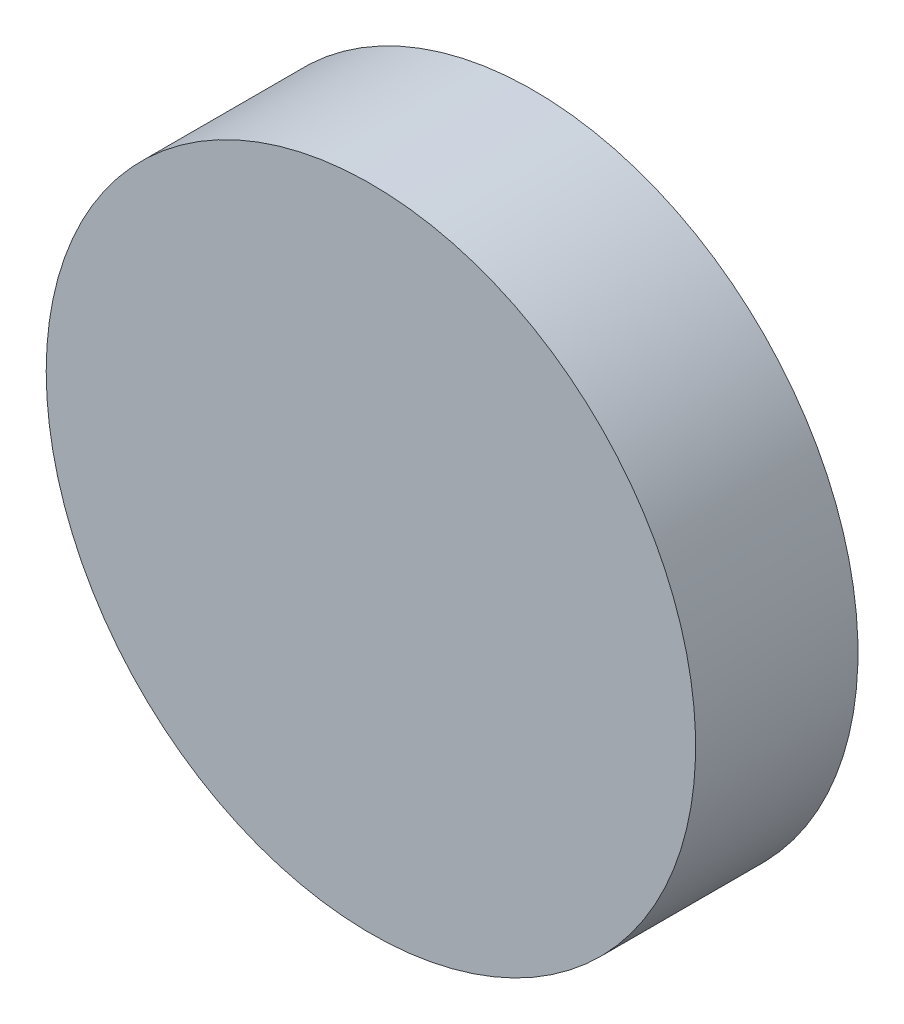
ISO-10303-21;
HEADER;
FILE_DESCRIPTION(('STEP AP214'),'2;1');
FILE_NAME('part.step','',(''),(''),'','','');
FILE_SCHEMA(('AUTOMOTIVE_DESIGN { 1 0 10303 214 1 1 1 1 }'));
ENDSEC;
DATA;
#1=APPLICATION_CONTEXT('core data for automotive mechanical design processes');
#2=APPLICATION_PROTOCOL_DEFINITION('international standard','automotive_design',2000,#1);
#3=PRODUCT_CONTEXT('',#1,'mechanical');
#4=PRODUCT('Part','Part','',(#3));
#5=PRODUCT_RELATED_PRODUCT_CATEGORY('part','',(#4));
#6=PRODUCT_DEFINITION_FORMATION('','',#4);
#7=PRODUCT_DEFINITION_CONTEXT('part definition',#1,'design');
#8=PRODUCT_DEFINITION('design','',#6,#7);
#9=PRODUCT_DEFINITION_SHAPE('','',#8);
#10=(LENGTH_UNIT() NAMED_UNIT(*) SI_UNIT(.MILLI.,.METRE.));
#11=(NAMED_UNIT(*) PLANE_ANGLE_UNIT() SI_UNIT($,.RADIAN.));
#12=(NAMED_UNIT(*) SI_UNIT($,.STERADIAN.) SOLID_ANGLE_UNIT());
#13=UNCERTAINTY_MEASURE_WITH_UNIT(LENGTH_MEASURE(1.E-05),#10,'distance_accuracy_value','');
#14=(GEOMETRIC_REPRESENTATION_CONTEXT(3) GLOBAL_UNCERTAINTY_ASSIGNED_CONTEXT((#13)) GLOBAL_UNIT_ASSIGNED_CONTEXT((#10,
#11,#12)) REPRESENTATION_CONTEXT('',''));
#15=CARTESIAN_POINT('',(0.,0.,0.));
#16=DIRECTION('',(0.,0.,1.));
#17=DIRECTION('',(1.,0.,0.));
#18=AXIS2_PLACEMENT_3D('',#15,#16,#17);
#19=CARTESIAN_POINT('',(0.,2.,0.));
#20=DIRECTION('',(0.,0.,1.));
#21=DIRECTION('',(1.,0.,0.));
#22=AXIS2_PLACEMENT_3D('',#19,#20,#21);
#23=PLANE('',#22);
#24=CARTESIAN_POINT('',(0.,0.,0.));
#25=DIRECTION('',(0.,0.,-1.));
#26=DIRECTION('',(-1.,0.,0.));
#27=AXIS2_PLACEMENT_3D('',#24,#25,#26);
#28=CIRCLE('',#27,2.);
#29=CARTESIAN_POINT('',(-2.,0.,0.));
#30=VERTEX_POINT('',#29);
#31=EDGE_CURVE('E10',#30,#30,#28,.T.);
#32=ORIENTED_EDGE('',*,*,#31,.F.);
#33=EDGE_LOOP('',(#32));
#34=FACE_BOUND('',#33,.T.);
#35=ADVANCED_FACE('F41',(#34),#23,.T.);
#36=CARTESIAN_POINT('',(0.,0.,-0.5));
#37=DIRECTION('',(0.,0.,-1.));
#38=DIRECTION('',(-1.,0.,0.));
#39=AXIS2_PLACEMENT_3D('',#36,#37,#38);
#40=CYLINDRICAL_SURFACE('',#39,2.);
#41=ORIENTED_EDGE('',*,*,#31,.T.);
#42=EDGE_LOOP('',(#41));
#43=FACE_BOUND('',#42,.T.);
#44=CARTESIAN_POINT('',(0.,0.,-1.));
#45=DIRECTION('',(0.,0.,-1.));
#46=DIRECTION('',(-1.,0.,0.));
#47=AXIS2_PLACEMENT_3D('',#44,#45,#46);
#48=CIRCLE('',#47,2.);
#49=CARTESIAN_POINT('',(-2.,0.,-1.));
#50=VERTEX_POINT('',#49);
#51=EDGE_CURVE('E48',#50,#50,#48,.T.);
#52=ORIENTED_EDGE('',*,*,#51,.F.);
#53=EDGE_LOOP('',(#52));
#54=FACE_BOUND('',#53,.T.);
#55=ADVANCED_FACE('F77',(#43,#54),#40,.T.);
#56=CARTESIAN_POINT('',(0.,2.,-1.));
#57=DIRECTION('',(0.,0.,-1.));
#58=DIRECTION('',(-1.,0.,0.));
#59=AXIS2_PLACEMENT_3D('',#56,#57,#58);
#60=PLANE('',#59);
#61=ORIENTED_EDGE('',*,*,#51,.T.);
#62=EDGE_LOOP('',(#61));
#63=FACE_BOUND('',#62,.T.);
#64=CARTESIAN_POINT('',(0.,0.,-1.));
#65=DIRECTION('',(0.,0.,-1.));
#66=DIRECTION('',(-1.,0.,0.));
#67=AXIS2_PLACEMENT_3D('',#64,#65,#66);
#68=CIRCLE('',#67,0.875);
#69=CARTESIAN_POINT('',(-0.875,0.,-1.));
#70=VERTEX_POINT('',#69);
#71=EDGE_CURVE('E53',#70,#70,#68,.T.);
#72=ORIENTED_EDGE('',*,*,#71,.F.);
#73=EDGE_LOOP('',(#72));
#74=FACE_BOUND('',#73,.T.);
#75=ADVANCED_FACE('F69',(#63,#74),#60,.T.);
#76=CARTESIAN_POINT('',(0.,0.,-0.5));
#77=DIRECTION('',(0.,0.,-1.));
#78=DIRECTION('',(-1.,0.,0.));
#79=AXIS2_PLACEMENT_3D('',#76,#77,#78);
#80=CYLINDRICAL_SURFACE('',#79,0.875);
#81=ORIENTED_EDGE('',*,*,#71,.T.);
#82=EDGE_LOOP('',(#81));
#83=FACE_BOUND('',#82,.T.);
#84=CARTESIAN_POINT('',(0.,0.,-0.5));
#85=DIRECTION('',(0.,0.,-1.));
#86=DIRECTION('',(-1.,0.,0.));
#87=AXIS2_PLACEMENT_3D('',#84,#85,#86);
#88=CIRCLE('',#87,0.875);
#89=CARTESIAN_POINT('',(-0.875,0.,-0.5));
#90=VERTEX_POINT('',#89);
#91=EDGE_CURVE('E58',#90,#90,#88,.T.);
#92=ORIENTED_EDGE('',*,*,#91,.F.);
#93=EDGE_LOOP('',(#92));
#94=FACE_BOUND('',#93,.T.);
#95=ADVANCED_FACE('F67',(#83,#94),#80,.F.);
#96=CARTESIAN_POINT('',(0.,0.875,-0.5));
#97=DIRECTION('',(0.,0.,-1.));
#98=DIRECTION('',(-1.,0.,0.));
#99=AXIS2_PLACEMENT_3D('',#96,#97,#98);
#100=PLANE('',#99);
#101=ORIENTED_EDGE('',*,*,#91,.T.);
#102=EDGE_LOOP('',(#101));
#103=FACE_BOUND('',#102,.T.);
#104=ADVANCED_FACE('F65',(#103),#100,.T.);
#105=CLOSED_SHELL('',(#35,#55,#75,#95,#104));
#106=MANIFOLD_SOLID_BREP('B2',#105);
#107=ADVANCED_BREP_SHAPE_REPRESENTATION('',(#18,#106),#14);
#108=SHAPE_DEFINITION_REPRESENTATION(#9,#107);
ENDSEC;
END-ISO-10303-21;
